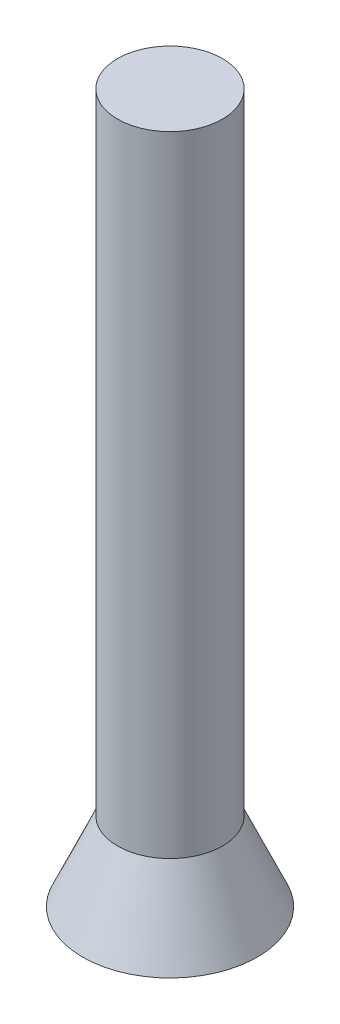
ISO-10303-21;
HEADER;
FILE_DESCRIPTION(('STEP AP214'),'2;1');
FILE_NAME('part.step','',(''),(''),'','','');
FILE_SCHEMA(('AUTOMOTIVE_DESIGN { 1 0 10303 214 1 1 1 1 }'));
ENDSEC;
DATA;
#1=APPLICATION_CONTEXT('core data for automotive mechanical design processes');
#2=APPLICATION_PROTOCOL_DEFINITION('international standard','automotive_design',2000,#1);
#3=PRODUCT_CONTEXT('',#1,'mechanical');
#4=PRODUCT('Part','Part','',(#3));
#5=PRODUCT_RELATED_PRODUCT_CATEGORY('part','',(#4));
#6=PRODUCT_DEFINITION_FORMATION('','',#4);
#7=PRODUCT_DEFINITION_CONTEXT('part definition',#1,'design');
#8=PRODUCT_DEFINITION('design','',#6,#7);
#9=PRODUCT_DEFINITION_SHAPE('','',#8);
#10=(LENGTH_UNIT() NAMED_UNIT(*) SI_UNIT(.MILLI.,.METRE.));
#11=(NAMED_UNIT(*) PLANE_ANGLE_UNIT() SI_UNIT($,.RADIAN.));
#12=(NAMED_UNIT(*) SI_UNIT($,.STERADIAN.) SOLID_ANGLE_UNIT());
#13=UNCERTAINTY_MEASURE_WITH_UNIT(LENGTH_MEASURE(1.E-05),#10,'distance_accuracy_value','');
#14=(GEOMETRIC_REPRESENTATION_CONTEXT(3) GLOBAL_UNCERTAINTY_ASSIGNED_CONTEXT((#13)) GLOBAL_UNIT_ASSIGNED_CONTEXT((#10,
#11,#12)) REPRESENTATION_CONTEXT('',''));
#15=CARTESIAN_POINT('',(0.,0.,0.));
#16=DIRECTION('',(0.,0.,1.));
#17=DIRECTION('',(1.,0.,0.));
#18=AXIS2_PLACEMENT_3D('',#15,#16,#17);
#19=CARTESIAN_POINT('',(0.,0.,0.));
#20=DIRECTION('',(0.,-1.,0.));
#21=DIRECTION('',(0.,0.,1.));
#22=AXIS2_PLACEMENT_3D('',#19,#20,#21);
#23=CONICAL_SURFACE('',#22,2.5,0.41887902047864);
#24=CARTESIAN_POINT('',(0.,2.25,0.));
#25=DIRECTION('',(0.,1.,0.));
#26=DIRECTION('',(0.,0.,1.));
#27=AXIS2_PLACEMENT_3D('',#24,#25,#26);
#28=CIRCLE('',#27,1.5);
#29=CARTESIAN_POINT('',(0.,2.25,1.5));
#30=VERTEX_POINT('',#29);
#31=EDGE_CURVE('E11',#30,#30,#28,.T.);
#32=ORIENTED_EDGE('',*,*,#31,.F.);
#33=EDGE_LOOP('',(#32));
#34=FACE_BOUND('',#33,.T.);
#35=CARTESIAN_POINT('',(0.,0.,0.));
#36=DIRECTION('',(0.,1.,0.));
#37=DIRECTION('',(0.,0.,1.));
#38=AXIS2_PLACEMENT_3D('',#35,#36,#37);
#39=CIRCLE('',#38,2.5);
#40=CARTESIAN_POINT('',(0.,0.,2.5));
#41=VERTEX_POINT('',#40);
#42=EDGE_CURVE('E43',#41,#41,#39,.T.);
#43=ORIENTED_EDGE('',*,*,#42,.T.);
#44=EDGE_LOOP('',(#43));
#45=FACE_BOUND('',#44,.T.);
#46=ADVANCED_FACE('F33',(#34,#45),#23,.T.);
#47=CARTESIAN_POINT('',(0.,0.,0.));
#48=DIRECTION('',(0.,1.,0.));
#49=DIRECTION('',(0.,0.,1.));
#50=AXIS2_PLACEMENT_3D('',#47,#48,#49);
#51=PLANE('',#50);
#52=DIRECTION('',(0.,0.,1.));
#53=VECTOR('',#52,1.);
#54=CARTESIAN_POINT('',(0.5,0.,-0.5));
#55=LINE('',#54,#53);
#56=CARTESIAN_POINT('',(0.5,0.,-2.));
#57=VERTEX_POINT('',#56);
#58=CARTESIAN_POINT('',(0.5,0.,-0.5));
#59=VERTEX_POINT('',#58);
#60=EDGE_CURVE('E142',#57,#59,#55,.T.);
#61=ORIENTED_EDGE('',*,*,#60,.F.);
#62=DIRECTION('',(1.,0.,0.));
#63=VECTOR('',#62,1.);
#64=CARTESIAN_POINT('',(-0.5,0.,-2.));
#65=LINE('',#64,#63);
#66=CARTESIAN_POINT('',(-0.5,0.,-2.));
#67=VERTEX_POINT('',#66);
#68=EDGE_CURVE('E50',#67,#57,#65,.T.);
#69=ORIENTED_EDGE('',*,*,#68,.F.);
#70=DIRECTION('',(0.,0.,-1.));
#71=VECTOR('',#70,1.);
#72=CARTESIAN_POINT('',(-0.5,0.,-0.5));
#73=LINE('',#72,#71);
#74=CARTESIAN_POINT('',(-0.5,0.,-0.5));
#75=VERTEX_POINT('',#74);
#76=EDGE_CURVE('E175',#75,#67,#73,.T.);
#77=ORIENTED_EDGE('',*,*,#76,.F.);
#78=DIRECTION('',(1.,0.,0.));
#79=VECTOR('',#78,1.);
#80=CARTESIAN_POINT('',(-2.,0.,-0.5));
#81=LINE('',#80,#79);
#82=CARTESIAN_POINT('',(-2.,0.,-0.5));
#83=VERTEX_POINT('',#82);
#84=EDGE_CURVE('E173',#83,#75,#81,.T.);
#85=ORIENTED_EDGE('',*,*,#84,.F.);
#86=DIRECTION('',(0.,0.,-1.));
#87=VECTOR('',#86,1.);
#88=CARTESIAN_POINT('',(-2.,0.,0.5));
#89=LINE('',#88,#87);
#90=CARTESIAN_POINT('',(-2.,0.,0.5));
#91=VERTEX_POINT('',#90);
#92=EDGE_CURVE('E170',#91,#83,#89,.T.);
#93=ORIENTED_EDGE('',*,*,#92,.F.);
#94=DIRECTION('',(-1.,0.,0.));
#95=VECTOR('',#94,1.);
#96=CARTESIAN_POINT('',(-2.,0.,0.5));
#97=LINE('',#96,#95);
#98=CARTESIAN_POINT('',(-0.5,0.,0.5));
#99=VERTEX_POINT('',#98);
#100=EDGE_CURVE('E167',#99,#91,#97,.T.);
#101=ORIENTED_EDGE('',*,*,#100,.F.);
#102=DIRECTION('',(0.,0.,-1.));
#103=VECTOR('',#102,1.);
#104=CARTESIAN_POINT('',(-0.5,0.,2.));
#105=LINE('',#104,#103);
#106=CARTESIAN_POINT('',(-0.5,0.,2.));
#107=VERTEX_POINT('',#106);
#108=EDGE_CURVE('E164',#107,#99,#105,.T.);
#109=ORIENTED_EDGE('',*,*,#108,.F.);
#110=DIRECTION('',(-1.,0.,0.));
#111=VECTOR('',#110,1.);
#112=CARTESIAN_POINT('',(-0.5,0.,2.));
#113=LINE('',#112,#111);
#114=CARTESIAN_POINT('',(0.5,0.,2.));
#115=VERTEX_POINT('',#114);
#116=EDGE_CURVE('E161',#115,#107,#113,.T.);
#117=ORIENTED_EDGE('',*,*,#116,.F.);
#118=DIRECTION('',(0.,0.,1.));
#119=VECTOR('',#118,1.);
#120=CARTESIAN_POINT('',(0.5,0.,2.));
#121=LINE('',#120,#119);
#122=CARTESIAN_POINT('',(0.5,0.,0.5));
#123=VERTEX_POINT('',#122);
#124=EDGE_CURVE('E158',#123,#115,#121,.T.);
#125=ORIENTED_EDGE('',*,*,#124,.F.);
#126=DIRECTION('',(-1.,0.,0.));
#127=VECTOR('',#126,1.);
#128=CARTESIAN_POINT('',(0.5,0.,0.5));
#129=LINE('',#128,#127);
#130=CARTESIAN_POINT('',(2.,0.,0.5));
#131=VERTEX_POINT('',#130);
#132=EDGE_CURVE('E152',#131,#123,#129,.T.);
#133=ORIENTED_EDGE('',*,*,#132,.F.);
#134=DIRECTION('',(0.,0.,1.));
#135=VECTOR('',#134,1.);
#136=CARTESIAN_POINT('',(2.,0.,0.5));
#137=LINE('',#136,#135);
#138=CARTESIAN_POINT('',(2.,0.,-0.5));
#139=VERTEX_POINT('',#138);
#140=EDGE_CURVE('E150',#139,#131,#137,.T.);
#141=ORIENTED_EDGE('',*,*,#140,.F.);
#142=DIRECTION('',(1.,0.,0.));
#143=VECTOR('',#142,1.);
#144=CARTESIAN_POINT('',(0.5,0.,-0.5));
#145=LINE('',#144,#143);
#146=EDGE_CURVE('E133',#59,#139,#145,.T.);
#147=ORIENTED_EDGE('',*,*,#146,.F.);
#148=EDGE_LOOP('',(#61,#69,#77,#85,#93,#101,#109,#117,#125,#133,#141,#147));
#149=FACE_BOUND('',#148,.T.);
#150=ORIENTED_EDGE('',*,*,#42,.F.);
#151=EDGE_LOOP('',(#150));
#152=FACE_BOUND('',#151,.T.);
#153=ADVANCED_FACE('F146',(#149,#152),#51,.F.);
#154=CARTESIAN_POINT('',(0.,20.25,0.));
#155=DIRECTION('',(0.,-1.,0.));
#156=DIRECTION('',(0.,0.,-1.));
#157=AXIS2_PLACEMENT_3D('',#154,#155,#156);
#158=CYLINDRICAL_SURFACE('',#157,1.5);
#159=CARTESIAN_POINT('',(0.,20.25,0.));
#160=DIRECTION('',(0.,1.,0.));
#161=DIRECTION('',(0.,0.,1.));
#162=AXIS2_PLACEMENT_3D('',#159,#160,#161);
#163=CIRCLE('',#162,1.5);
#164=CARTESIAN_POINT('',(0.,20.25,1.5));
#165=VERTEX_POINT('',#164);
#166=EDGE_CURVE('E179',#165,#165,#163,.T.);
#167=ORIENTED_EDGE('',*,*,#166,.F.);
#168=EDGE_LOOP('',(#167));
#169=FACE_BOUND('',#168,.T.);
#170=ORIENTED_EDGE('',*,*,#31,.T.);
#171=EDGE_LOOP('',(#170));
#172=FACE_BOUND('',#171,.T.);
#173=ADVANCED_FACE('F238',(#169,#172),#158,.T.);
#174=CARTESIAN_POINT('',(0.,20.25,0.));
#175=DIRECTION('',(0.,1.,0.));
#176=DIRECTION('',(0.,0.,1.));
#177=AXIS2_PLACEMENT_3D('',#174,#175,#176);
#178=PLANE('',#177);
#179=ORIENTED_EDGE('',*,*,#166,.T.);
#180=EDGE_LOOP('',(#179));
#181=FACE_BOUND('',#180,.T.);
#182=ADVANCED_FACE('F247',(#181),#178,.T.);
#183=CARTESIAN_POINT('',(-0.5,0.,-2.));
#184=DIRECTION('',(0.,0.284015344703923,-0.958819734868193));
#185=DIRECTION('',(0.,0.958819734868193,0.284015344703923));
#186=AXIS2_PLACEMENT_3D('',#183,#184,#185);
#187=PLANE('',#186);
#188=ORIENTED_EDGE('',*,*,#68,.T.);
#189=DIRECTION('',(0.273209828505095,-0.922340923529056,-0.273209828505095));
#190=VECTOR('',#189,1.);
#191=CARTESIAN_POINT('',(0.425356389608217,0.251992605540605,-1.92535638960822));
#192=LINE('',#191,#190);
#193=CARTESIAN_POINT('',(0.0556797575568785,1.5,-1.55567975755688));
#194=VERTEX_POINT('',#193);
#195=EDGE_CURVE('E93',#194,#57,#192,.T.);
#196=ORIENTED_EDGE('',*,*,#195,.F.);
#197=DIRECTION('',(1.,0.,0.));
#198=VECTOR('',#197,1.);
#199=CARTESIAN_POINT('',(-0.5,1.5,-1.55567975755688));
#200=LINE('',#199,#198);
#201=CARTESIAN_POINT('',(-0.0556797575568784,1.5,-1.55567975755688));
#202=VERTEX_POINT('',#201);
#203=EDGE_CURVE('E177',#202,#194,#200,.T.);
#204=ORIENTED_EDGE('',*,*,#203,.F.);
#205=DIRECTION('',(-0.273209828505095,-0.922340923529056,-0.273209828505095));
#206=VECTOR('',#205,1.);
#207=CARTESIAN_POINT('',(-0.388034584412325,0.377988908310907,-1.88803458441232));
#208=LINE('',#207,#206);
#209=EDGE_CURVE('E58',#202,#67,#208,.T.);
#210=ORIENTED_EDGE('',*,*,#209,.T.);
#211=EDGE_LOOP('',(#188,#196,#204,#210));
#212=FACE_BOUND('',#211,.T.);
#213=ADVANCED_FACE('F275',(#212),#187,.F.);
#214=CARTESIAN_POINT('',(-0.5,0.,-0.5));
#215=DIRECTION('',(-0.958819734868193,0.284015344703923,0.));
#216=DIRECTION('',(-0.284015344703923,-0.958819734868193,0.));
#217=AXIS2_PLACEMENT_3D('',#214,#215,#216);
#218=PLANE('',#217);
#219=ORIENTED_EDGE('',*,*,#76,.T.);
#220=ORIENTED_EDGE('',*,*,#209,.F.);
#221=DIRECTION('',(0.,0.,-1.));
#222=VECTOR('',#221,1.);
#223=CARTESIAN_POINT('',(-0.0556797575568785,1.5,-0.5));
#224=LINE('',#223,#222);
#225=CARTESIAN_POINT('',(-0.0556797575568785,1.5,-0.0556797575568784));
#226=VERTEX_POINT('',#225);
#227=EDGE_CURVE('E180',#226,#202,#224,.T.);
#228=ORIENTED_EDGE('',*,*,#227,.F.);
#229=DIRECTION('',(-0.273209828505095,-0.922340923529056,-0.273209828505095));
#230=VECTOR('',#229,1.);
#231=CARTESIAN_POINT('',(-0.5,0.,-0.5));
#232=LINE('',#231,#230);
#233=EDGE_CURVE('E98',#226,#75,#232,.T.);
#234=ORIENTED_EDGE('',*,*,#233,.T.);
#235=EDGE_LOOP('',(#219,#220,#228,#234));
#236=FACE_BOUND('',#235,.T.);
#237=ADVANCED_FACE('F288',(#236),#218,.F.);
#238=CARTESIAN_POINT('',(-2.,0.,-0.5));
#239=DIRECTION('',(0.,0.284015344703923,-0.958819734868193));
#240=DIRECTION('',(0.,0.958819734868193,0.284015344703923));
#241=AXIS2_PLACEMENT_3D('',#238,#239,#240);
#242=PLANE('',#241);
#243=ORIENTED_EDGE('',*,*,#84,.T.);
#244=ORIENTED_EDGE('',*,*,#233,.F.);
#245=DIRECTION('',(1.,0.,0.));
#246=VECTOR('',#245,1.);
#247=CARTESIAN_POINT('',(-2.,1.5,-0.0556797575568787));
#248=LINE('',#247,#246);
#249=CARTESIAN_POINT('',(-1.55567975755688,1.5,-0.0556797575568787));
#250=VERTEX_POINT('',#249);
#251=EDGE_CURVE('E203',#250,#226,#248,.T.);
#252=ORIENTED_EDGE('',*,*,#251,.F.);
#253=DIRECTION('',(-0.273209828505095,-0.922340923529056,-0.273209828505095));
#254=VECTOR('',#253,1.);
#255=CARTESIAN_POINT('',(-1.92535638960822,0.251992605540605,-0.425356389608217));
#256=LINE('',#255,#254);
#257=EDGE_CURVE('E195',#250,#83,#256,.T.);
#258=ORIENTED_EDGE('',*,*,#257,.T.);
#259=EDGE_LOOP('',(#243,#244,#252,#258));
#260=FACE_BOUND('',#259,.T.);
#261=ADVANCED_FACE('F297',(#260),#242,.F.);
#262=CARTESIAN_POINT('',(-2.,0.,0.5));
#263=DIRECTION('',(-0.958819734868193,0.284015344703923,0.));
#264=DIRECTION('',(-0.284015344703923,-0.958819734868193,0.));
#265=AXIS2_PLACEMENT_3D('',#262,#263,#264);
#266=PLANE('',#265);
#267=ORIENTED_EDGE('',*,*,#92,.T.);
#268=ORIENTED_EDGE('',*,*,#257,.F.);
#269=DIRECTION('',(0.,0.,-1.));
#270=VECTOR('',#269,1.);
#271=CARTESIAN_POINT('',(-1.55567975755688,1.5,0.5));
#272=LINE('',#271,#270);
#273=CARTESIAN_POINT('',(-1.55567975755688,1.5,0.0556797575568783));
#274=VERTEX_POINT('',#273);
#275=EDGE_CURVE('E206',#274,#250,#272,.T.);
#276=ORIENTED_EDGE('',*,*,#275,.F.);
#277=DIRECTION('',(-0.273209828505095,-0.922340923529056,0.273209828505095));
#278=VECTOR('',#277,1.);
#279=CARTESIAN_POINT('',(-2.,0.,0.5));
#280=LINE('',#279,#278);
#281=EDGE_CURVE('E193',#274,#91,#280,.T.);
#282=ORIENTED_EDGE('',*,*,#281,.T.);
#283=EDGE_LOOP('',(#267,#268,#276,#282));
#284=FACE_BOUND('',#283,.T.);
#285=ADVANCED_FACE('F305',(#284),#266,.F.);
#286=CARTESIAN_POINT('',(-2.,0.,0.5));
#287=DIRECTION('',(0.,0.284015344703923,0.958819734868193));
#288=DIRECTION('',(0.,-0.958819734868193,0.284015344703923));
#289=AXIS2_PLACEMENT_3D('',#286,#287,#288);
#290=PLANE('',#289);
#291=ORIENTED_EDGE('',*,*,#100,.T.);
#292=ORIENTED_EDGE('',*,*,#281,.F.);
#293=DIRECTION('',(-1.,0.,0.));
#294=VECTOR('',#293,1.);
#295=CARTESIAN_POINT('',(-2.,1.5,0.0556797575568783));
#296=LINE('',#295,#294);
#297=CARTESIAN_POINT('',(-0.0556797575568785,1.5,0.0556797575568785));
#298=VERTEX_POINT('',#297);
#299=EDGE_CURVE('E209',#298,#274,#296,.T.);
#300=ORIENTED_EDGE('',*,*,#299,.F.);
#301=DIRECTION('',(-0.273209828505095,-0.922340923529056,0.273209828505095));
#302=VECTOR('',#301,1.);
#303=CARTESIAN_POINT('',(-0.611965415587675,-0.377988908310907,0.611965415587675));
#304=LINE('',#303,#302);
#305=EDGE_CURVE('E191',#298,#99,#304,.T.);
#306=ORIENTED_EDGE('',*,*,#305,.T.);
#307=EDGE_LOOP('',(#291,#292,#300,#306));
#308=FACE_BOUND('',#307,.T.);
#309=ADVANCED_FACE('F315',(#308),#290,.F.);
#310=CARTESIAN_POINT('',(-0.5,0.,2.));
#311=DIRECTION('',(-0.958819734868193,0.284015344703923,0.));
#312=DIRECTION('',(-0.284015344703923,-0.958819734868193,0.));
#313=AXIS2_PLACEMENT_3D('',#310,#311,#312);
#314=PLANE('',#313);
#315=ORIENTED_EDGE('',*,*,#108,.T.);
#316=ORIENTED_EDGE('',*,*,#305,.F.);
#317=DIRECTION('',(0.,0.,-1.));
#318=VECTOR('',#317,1.);
#319=CARTESIAN_POINT('',(-0.0556797575568784,1.5,2.));
#320=LINE('',#319,#318);
#321=CARTESIAN_POINT('',(-0.0556797575568784,1.5,1.55567975755688));
#322=VERTEX_POINT('',#321);
#323=EDGE_CURVE('E212',#322,#298,#320,.T.);
#324=ORIENTED_EDGE('',*,*,#323,.F.);
#325=DIRECTION('',(-0.273209828505095,-0.922340923529056,0.273209828505095));
#326=VECTOR('',#325,1.);
#327=CARTESIAN_POINT('',(-0.5,0.,2.));
#328=LINE('',#327,#326);
#329=EDGE_CURVE('E189',#322,#107,#328,.T.);
#330=ORIENTED_EDGE('',*,*,#329,.T.);
#331=EDGE_LOOP('',(#315,#316,#324,#330));
#332=FACE_BOUND('',#331,.T.);
#333=ADVANCED_FACE('F325',(#332),#314,.F.);
#334=CARTESIAN_POINT('',(-0.5,0.,2.));
#335=DIRECTION('',(0.,0.284015344703923,0.958819734868193));
#336=DIRECTION('',(0.,-0.958819734868193,0.284015344703923));
#337=AXIS2_PLACEMENT_3D('',#334,#335,#336);
#338=PLANE('',#337);
#339=ORIENTED_EDGE('',*,*,#116,.T.);
#340=ORIENTED_EDGE('',*,*,#329,.F.);
#341=DIRECTION('',(-1.,0.,0.));
#342=VECTOR('',#341,1.);
#343=CARTESIAN_POINT('',(-0.5,1.5,1.55567975755688));
#344=LINE('',#343,#342);
#345=CARTESIAN_POINT('',(0.0556797575568785,1.5,1.55567975755688));
#346=VERTEX_POINT('',#345);
#347=EDGE_CURVE('E215',#346,#322,#344,.T.);
#348=ORIENTED_EDGE('',*,*,#347,.F.);
#349=DIRECTION('',(0.273209828505095,-0.922340923529056,0.273209828505095));
#350=VECTOR('',#349,1.);
#351=CARTESIAN_POINT('',(0.5,0.,2.));
#352=LINE('',#351,#350);
#353=EDGE_CURVE('E187',#346,#115,#352,.T.);
#354=ORIENTED_EDGE('',*,*,#353,.T.);
#355=EDGE_LOOP('',(#339,#340,#348,#354));
#356=FACE_BOUND('',#355,.T.);
#357=ADVANCED_FACE('F335',(#356),#338,.F.);
#358=CARTESIAN_POINT('',(0.5,0.,2.));
#359=DIRECTION('',(0.958819734868193,0.284015344703923,0.));
#360=DIRECTION('',(-0.284015344703923,0.958819734868193,0.));
#361=AXIS2_PLACEMENT_3D('',#358,#359,#360);
#362=PLANE('',#361);
#363=ORIENTED_EDGE('',*,*,#124,.T.);
#364=ORIENTED_EDGE('',*,*,#353,.F.);
#365=DIRECTION('',(0.,0.,1.));
#366=VECTOR('',#365,1.);
#367=CARTESIAN_POINT('',(0.0556797575568786,1.5,2.));
#368=LINE('',#367,#366);
#369=CARTESIAN_POINT('',(0.0556797575568782,1.5,0.0556797575568784));
#370=VERTEX_POINT('',#369);
#371=EDGE_CURVE('E218',#370,#346,#368,.T.);
#372=ORIENTED_EDGE('',*,*,#371,.F.);
#373=DIRECTION('',(0.273209828505095,-0.922340923529057,0.273209828505095));
#374=VECTOR('',#373,1.);
#375=CARTESIAN_POINT('',(0.611965415587675,-0.377988908310907,0.611965415587676));
#376=LINE('',#375,#374);
#377=EDGE_CURVE('E185',#370,#123,#376,.T.);
#378=ORIENTED_EDGE('',*,*,#377,.T.);
#379=EDGE_LOOP('',(#363,#364,#372,#378));
#380=FACE_BOUND('',#379,.T.);
#381=ADVANCED_FACE('F345',(#380),#362,.F.);
#382=CARTESIAN_POINT('',(0.5,0.,0.5));
#383=DIRECTION('',(0.,0.284015344703923,0.958819734868193));
#384=DIRECTION('',(0.,-0.958819734868193,0.284015344703923));
#385=AXIS2_PLACEMENT_3D('',#382,#383,#384);
#386=PLANE('',#385);
#387=ORIENTED_EDGE('',*,*,#132,.T.);
#388=ORIENTED_EDGE('',*,*,#377,.F.);
#389=DIRECTION('',(-1.,0.,0.));
#390=VECTOR('',#389,1.);
#391=CARTESIAN_POINT('',(0.5,1.5,0.0556797575568784));
#392=LINE('',#391,#390);
#393=CARTESIAN_POINT('',(1.55567975755688,1.5,0.0556797575568786));
#394=VERTEX_POINT('',#393);
#395=EDGE_CURVE('E221',#394,#370,#392,.T.);
#396=ORIENTED_EDGE('',*,*,#395,.F.);
#397=DIRECTION('',(0.273209828505095,-0.922340923529057,0.273209828505095));
#398=VECTOR('',#397,1.);
#399=CARTESIAN_POINT('',(2.,0.,0.5));
#400=LINE('',#399,#398);
#401=EDGE_CURVE('E183',#394,#131,#400,.T.);
#402=ORIENTED_EDGE('',*,*,#401,.T.);
#403=EDGE_LOOP('',(#387,#388,#396,#402));
#404=FACE_BOUND('',#403,.T.);
#405=ADVANCED_FACE('F355',(#404),#386,.F.);
#406=CARTESIAN_POINT('',(2.,0.,0.5));
#407=DIRECTION('',(0.958819734868193,0.284015344703923,0.));
#408=DIRECTION('',(-0.284015344703923,0.958819734868193,0.));
#409=AXIS2_PLACEMENT_3D('',#406,#407,#408);
#410=PLANE('',#409);
#411=ORIENTED_EDGE('',*,*,#140,.T.);
#412=ORIENTED_EDGE('',*,*,#401,.F.);
#413=DIRECTION('',(0.,0.,1.));
#414=VECTOR('',#413,1.);
#415=CARTESIAN_POINT('',(1.55567975755688,1.5,0.5));
#416=LINE('',#415,#414);
#417=CARTESIAN_POINT('',(1.55567975755688,1.5,-0.0556797575568783));
#418=VERTEX_POINT('',#417);
#419=EDGE_CURVE('E224',#418,#394,#416,.T.);
#420=ORIENTED_EDGE('',*,*,#419,.F.);
#421=DIRECTION('',(0.273209828505095,-0.922340923529056,-0.273209828505095));
#422=VECTOR('',#421,1.);
#423=CARTESIAN_POINT('',(1.88803458441232,0.377988908310907,-0.388034584412324));
#424=LINE('',#423,#422);
#425=EDGE_CURVE('E139',#418,#139,#424,.T.);
#426=ORIENTED_EDGE('',*,*,#425,.T.);
#427=EDGE_LOOP('',(#411,#412,#420,#426));
#428=FACE_BOUND('',#427,.T.);
#429=ADVANCED_FACE('F365',(#428),#410,.F.);
#430=CARTESIAN_POINT('',(0.5,0.,-0.5));
#431=DIRECTION('',(0.,0.284015344703923,-0.958819734868193));
#432=DIRECTION('',(0.,0.958819734868193,0.284015344703923));
#433=AXIS2_PLACEMENT_3D('',#430,#431,#432);
#434=PLANE('',#433);
#435=ORIENTED_EDGE('',*,*,#146,.T.);
#436=ORIENTED_EDGE('',*,*,#425,.F.);
#437=DIRECTION('',(1.,0.,0.));
#438=VECTOR('',#437,1.);
#439=CARTESIAN_POINT('',(0.5,1.5,-0.0556797575568785));
#440=LINE('',#439,#438);
#441=CARTESIAN_POINT('',(0.0556797575568784,1.5,-0.0556797575568785));
#442=VERTEX_POINT('',#441);
#443=EDGE_CURVE('E136',#442,#418,#440,.T.);
#444=ORIENTED_EDGE('',*,*,#443,.F.);
#445=DIRECTION('',(0.273209828505095,-0.922340923529056,-0.273209828505095));
#446=VECTOR('',#445,1.);
#447=CARTESIAN_POINT('',(0.5,0.,-0.5));
#448=LINE('',#447,#446);
#449=EDGE_CURVE('E129',#442,#59,#448,.T.);
#450=ORIENTED_EDGE('',*,*,#449,.T.);
#451=EDGE_LOOP('',(#435,#436,#444,#450));
#452=FACE_BOUND('',#451,.T.);
#453=ADVANCED_FACE('F131',(#452),#434,.F.);
#454=CARTESIAN_POINT('',(0.5,0.,-0.5));
#455=DIRECTION('',(0.958819734868193,0.284015344703923,0.));
#456=DIRECTION('',(-0.284015344703923,0.958819734868193,0.));
#457=AXIS2_PLACEMENT_3D('',#454,#455,#456);
#458=PLANE('',#457);
#459=ORIENTED_EDGE('',*,*,#60,.T.);
#460=ORIENTED_EDGE('',*,*,#449,.F.);
#461=DIRECTION('',(0.,0.,1.));
#462=VECTOR('',#461,1.);
#463=CARTESIAN_POINT('',(0.0556797575568785,1.5,-0.5));
#464=LINE('',#463,#462);
#465=EDGE_CURVE('E200',#194,#442,#464,.T.);
#466=ORIENTED_EDGE('',*,*,#465,.F.);
#467=ORIENTED_EDGE('',*,*,#195,.T.);
#468=EDGE_LOOP('',(#459,#460,#466,#467));
#469=FACE_BOUND('',#468,.T.);
#470=ADVANCED_FACE('F143',(#469),#458,.F.);
#471=CARTESIAN_POINT('',(0.,1.5,0.));
#472=DIRECTION('',(0.,1.,0.));
#473=DIRECTION('',(0.,0.,1.));
#474=AXIS2_PLACEMENT_3D('',#471,#472,#473);
#475=PLANE('',#474);
#476=ORIENTED_EDGE('',*,*,#203,.T.);
#477=ORIENTED_EDGE('',*,*,#465,.T.);
#478=ORIENTED_EDGE('',*,*,#443,.T.);
#479=ORIENTED_EDGE('',*,*,#419,.T.);
#480=ORIENTED_EDGE('',*,*,#395,.T.);
#481=ORIENTED_EDGE('',*,*,#371,.T.);
#482=ORIENTED_EDGE('',*,*,#347,.T.);
#483=ORIENTED_EDGE('',*,*,#323,.T.);
#484=ORIENTED_EDGE('',*,*,#299,.T.);
#485=ORIENTED_EDGE('',*,*,#275,.T.);
#486=ORIENTED_EDGE('',*,*,#251,.T.);
#487=ORIENTED_EDGE('',*,*,#227,.T.);
#488=EDGE_LOOP('',(#476,#477,#478,#479,#480,#481,#482,#483,#484,#485,#486,#487));
#489=FACE_BOUND('',#488,.T.);
#490=ADVANCED_FACE('F392',(#489),#475,.F.);
#491=CLOSED_SHELL('',(#46,#153,#173,#182,#213,#237,#261,#285,#309,#333,#357,#381,#405,#429,#453,
#470,#490));
#492=MANIFOLD_SOLID_BREP('B2',#491);
#493=ADVANCED_BREP_SHAPE_REPRESENTATION('',(#18,#492),#14);
#494=SHAPE_DEFINITION_REPRESENTATION(#9,#493);
ENDSEC;
END-ISO-10303-21;
